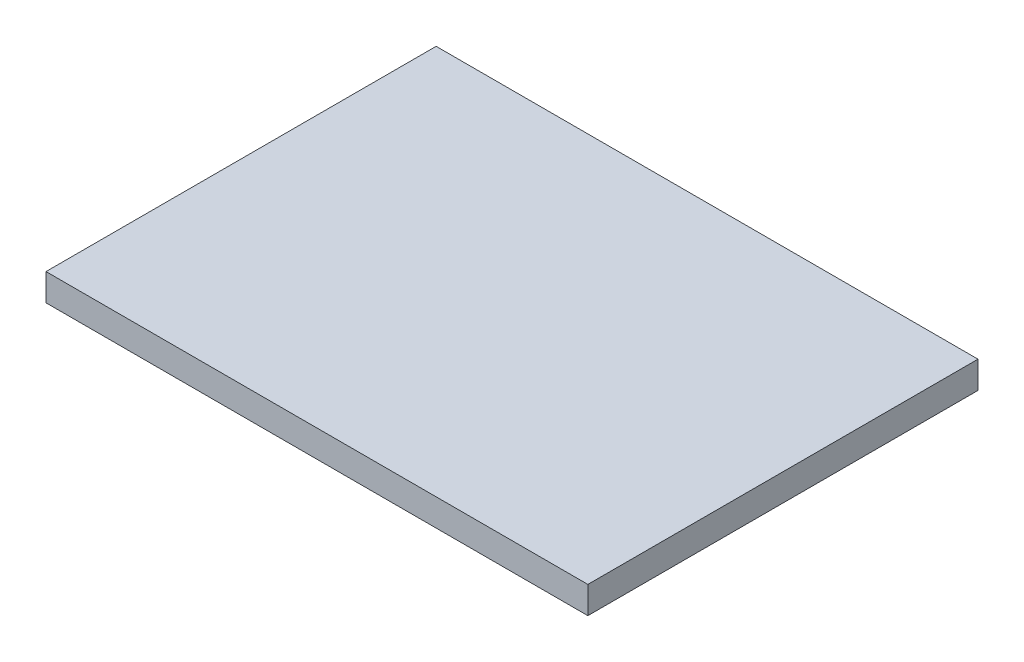
ISO-10303-21;
HEADER;
FILE_DESCRIPTION(('STEP AP214'),'2;1');
FILE_NAME('part.step','',(''),(''),'','','');
FILE_SCHEMA(('AUTOMOTIVE_DESIGN { 1 0 10303 214 1 1 1 1 }'));
ENDSEC;
DATA;
#1=APPLICATION_CONTEXT('core data for automotive mechanical design processes');
#2=APPLICATION_PROTOCOL_DEFINITION('international standard','automotive_design',2000,#1);
#3=PRODUCT_CONTEXT('',#1,'mechanical');
#4=PRODUCT('Part','Part','',(#3));
#5=PRODUCT_RELATED_PRODUCT_CATEGORY('part','',(#4));
#6=PRODUCT_DEFINITION_FORMATION('','',#4);
#7=PRODUCT_DEFINITION_CONTEXT('part definition',#1,'design');
#8=PRODUCT_DEFINITION('design','',#6,#7);
#9=PRODUCT_DEFINITION_SHAPE('','',#8);
#10=(LENGTH_UNIT() NAMED_UNIT(*) SI_UNIT(.MILLI.,.METRE.));
#11=(NAMED_UNIT(*) PLANE_ANGLE_UNIT() SI_UNIT($,.RADIAN.));
#12=(NAMED_UNIT(*) SI_UNIT($,.STERADIAN.) SOLID_ANGLE_UNIT());
#13=UNCERTAINTY_MEASURE_WITH_UNIT(LENGTH_MEASURE(1.E-05),#10,'distance_accuracy_value','');
#14=(GEOMETRIC_REPRESENTATION_CONTEXT(3) GLOBAL_UNCERTAINTY_ASSIGNED_CONTEXT((#13)) GLOBAL_UNIT_ASSIGNED_CONTEXT((#10,
#11,#12)) REPRESENTATION_CONTEXT('',''));
#15=CARTESIAN_POINT('',(0.,0.,0.));
#16=DIRECTION('',(0.,0.,1.));
#17=DIRECTION('',(1.,0.,0.));
#18=AXIS2_PLACEMENT_3D('',#15,#16,#17);
#19=CARTESIAN_POINT('',(0.,3.175,0.));
#20=DIRECTION('',(1.,0.,0.));
#21=DIRECTION('',(0.,0.,-1.));
#22=AXIS2_PLACEMENT_3D('',#19,#20,#21);
#23=PLANE('',#22);
#24=DIRECTION('',(0.,0.,1.));
#25=VECTOR('',#24,1.);
#26=CARTESIAN_POINT('',(0.,0.,0.));
#27=LINE('',#26,#25);
#28=CARTESIAN_POINT('',(0.,0.,-45.72));
#29=VERTEX_POINT('',#28);
#30=CARTESIAN_POINT('',(0.,0.,0.));
#31=VERTEX_POINT('',#30);
#32=EDGE_CURVE('E96',#29,#31,#27,.T.);
#33=ORIENTED_EDGE('',*,*,#32,.T.);
#34=DIRECTION('',(0.,-1.,0.));
#35=VECTOR('',#34,1.);
#36=CARTESIAN_POINT('',(0.,3.175,0.));
#37=LINE('',#36,#35);
#38=CARTESIAN_POINT('',(0.,3.175,0.));
#39=VERTEX_POINT('',#38);
#40=EDGE_CURVE('E11',#39,#31,#37,.T.);
#41=ORIENTED_EDGE('',*,*,#40,.F.);
#42=DIRECTION('',(0.,0.,1.));
#43=VECTOR('',#42,1.);
#44=CARTESIAN_POINT('',(0.,3.175,0.));
#45=LINE('',#44,#43);
#46=CARTESIAN_POINT('',(0.,3.175,-45.72));
#47=VERTEX_POINT('',#46);
#48=EDGE_CURVE('E84',#47,#39,#45,.T.);
#49=ORIENTED_EDGE('',*,*,#48,.F.);
#50=DIRECTION('',(0.,-1.,0.));
#51=VECTOR('',#50,1.);
#52=CARTESIAN_POINT('',(0.,3.175,-45.72));
#53=LINE('',#52,#51);
#54=EDGE_CURVE('E92',#47,#29,#53,.T.);
#55=ORIENTED_EDGE('',*,*,#54,.T.);
#56=EDGE_LOOP('',(#33,#41,#49,#55));
#57=FACE_BOUND('',#56,.T.);
#58=ADVANCED_FACE('F33',(#57),#23,.F.);
#59=CARTESIAN_POINT('',(0.,3.175,0.));
#60=DIRECTION('',(0.,0.,-1.));
#61=DIRECTION('',(-1.,0.,0.));
#62=AXIS2_PLACEMENT_3D('',#59,#60,#61);
#63=PLANE('',#62);
#64=DIRECTION('',(1.,0.,0.));
#65=VECTOR('',#64,1.);
#66=CARTESIAN_POINT('',(0.,0.,0.));
#67=LINE('',#66,#65);
#68=CARTESIAN_POINT('',(63.5,0.,0.));
#69=VERTEX_POINT('',#68);
#70=EDGE_CURVE('E88',#31,#69,#67,.T.);
#71=ORIENTED_EDGE('',*,*,#70,.T.);
#72=DIRECTION('',(0.,-1.,0.));
#73=VECTOR('',#72,1.);
#74=CARTESIAN_POINT('',(63.5,3.175,0.));
#75=LINE('',#74,#73);
#76=CARTESIAN_POINT('',(63.5,3.175,0.));
#77=VERTEX_POINT('',#76);
#78=EDGE_CURVE('E41',#77,#69,#75,.T.);
#79=ORIENTED_EDGE('',*,*,#78,.F.);
#80=DIRECTION('',(1.,0.,0.));
#81=VECTOR('',#80,1.);
#82=CARTESIAN_POINT('',(0.,3.175,0.));
#83=LINE('',#82,#81);
#84=EDGE_CURVE('E79',#39,#77,#83,.T.);
#85=ORIENTED_EDGE('',*,*,#84,.F.);
#86=ORIENTED_EDGE('',*,*,#40,.T.);
#87=EDGE_LOOP('',(#71,#79,#85,#86));
#88=FACE_BOUND('',#87,.T.);
#89=ADVANCED_FACE('F87',(#88),#63,.F.);
#90=CARTESIAN_POINT('',(63.5,3.175,0.));
#91=DIRECTION('',(-1.,0.,0.));
#92=DIRECTION('',(0.,0.,1.));
#93=AXIS2_PLACEMENT_3D('',#90,#91,#92);
#94=PLANE('',#93);
#95=DIRECTION('',(0.,0.,-1.));
#96=VECTOR('',#95,1.);
#97=CARTESIAN_POINT('',(63.5,0.,0.));
#98=LINE('',#97,#96);
#99=CARTESIAN_POINT('',(63.5,0.,-45.72));
#100=VERTEX_POINT('',#99);
#101=EDGE_CURVE('E66',#69,#100,#98,.T.);
#102=ORIENTED_EDGE('',*,*,#101,.T.);
#103=DIRECTION('',(0.,-1.,0.));
#104=VECTOR('',#103,1.);
#105=CARTESIAN_POINT('',(63.5,3.175,-45.72));
#106=LINE('',#105,#104);
#107=CARTESIAN_POINT('',(63.5,3.175,-45.72));
#108=VERTEX_POINT('',#107);
#109=EDGE_CURVE('E89',#108,#100,#106,.T.);
#110=ORIENTED_EDGE('',*,*,#109,.F.);
#111=DIRECTION('',(0.,0.,-1.));
#112=VECTOR('',#111,1.);
#113=CARTESIAN_POINT('',(63.5,3.175,0.));
#114=LINE('',#113,#112);
#115=EDGE_CURVE('E82',#77,#108,#114,.T.);
#116=ORIENTED_EDGE('',*,*,#115,.F.);
#117=ORIENTED_EDGE('',*,*,#78,.T.);
#118=EDGE_LOOP('',(#102,#110,#116,#117));
#119=FACE_BOUND('',#118,.T.);
#120=ADVANCED_FACE('F90',(#119),#94,.F.);
#121=CARTESIAN_POINT('',(0.,3.175,-45.72));
#122=DIRECTION('',(0.,0.,1.));
#123=DIRECTION('',(1.,0.,0.));
#124=AXIS2_PLACEMENT_3D('',#121,#122,#123);
#125=PLANE('',#124);
#126=DIRECTION('',(-1.,0.,0.));
#127=VECTOR('',#126,1.);
#128=CARTESIAN_POINT('',(0.,0.,-45.72));
#129=LINE('',#128,#127);
#130=EDGE_CURVE('E72',#100,#29,#129,.T.);
#131=ORIENTED_EDGE('',*,*,#130,.T.);
#132=ORIENTED_EDGE('',*,*,#54,.F.);
#133=DIRECTION('',(-1.,0.,0.));
#134=VECTOR('',#133,1.);
#135=CARTESIAN_POINT('',(0.,3.175,-45.72));
#136=LINE('',#135,#134);
#137=EDGE_CURVE('E49',#108,#47,#136,.T.);
#138=ORIENTED_EDGE('',*,*,#137,.F.);
#139=ORIENTED_EDGE('',*,*,#109,.T.);
#140=EDGE_LOOP('',(#131,#132,#138,#139));
#141=FACE_BOUND('',#140,.T.);
#142=ADVANCED_FACE('F103',(#141),#125,.F.);
#143=CARTESIAN_POINT('',(0.,3.175,0.));
#144=DIRECTION('',(0.,-1.,0.));
#145=DIRECTION('',(0.,0.,-1.));
#146=AXIS2_PLACEMENT_3D('',#143,#144,#145);
#147=PLANE('',#146);
#148=ORIENTED_EDGE('',*,*,#48,.T.);
#149=ORIENTED_EDGE('',*,*,#84,.T.);
#150=ORIENTED_EDGE('',*,*,#115,.T.);
#151=ORIENTED_EDGE('',*,*,#137,.T.);
#152=EDGE_LOOP('',(#148,#149,#150,#151));
#153=FACE_BOUND('',#152,.T.);
#154=ADVANCED_FACE('F80',(#153),#147,.F.);
#155=CARTESIAN_POINT('',(0.,0.,0.));
#156=DIRECTION('',(0.,-1.,0.));
#157=DIRECTION('',(0.,0.,-1.));
#158=AXIS2_PLACEMENT_3D('',#155,#156,#157);
#159=PLANE('',#158);
#160=ORIENTED_EDGE('',*,*,#32,.F.);
#161=ORIENTED_EDGE('',*,*,#130,.F.);
#162=ORIENTED_EDGE('',*,*,#101,.F.);
#163=ORIENTED_EDGE('',*,*,#70,.F.);
#164=EDGE_LOOP('',(#160,#161,#162,#163));
#165=FACE_BOUND('',#164,.T.);
#166=ADVANCED_FACE('F106',(#165),#159,.T.);
#167=CLOSED_SHELL('',(#58,#89,#120,#142,#154,#166));
#168=MANIFOLD_SOLID_BREP('B2',#167);
#169=ADVANCED_BREP_SHAPE_REPRESENTATION('',(#18,#168),#14);
#170=SHAPE_DEFINITION_REPRESENTATION(#9,#169);
ENDSEC;
END-ISO-10303-21;
